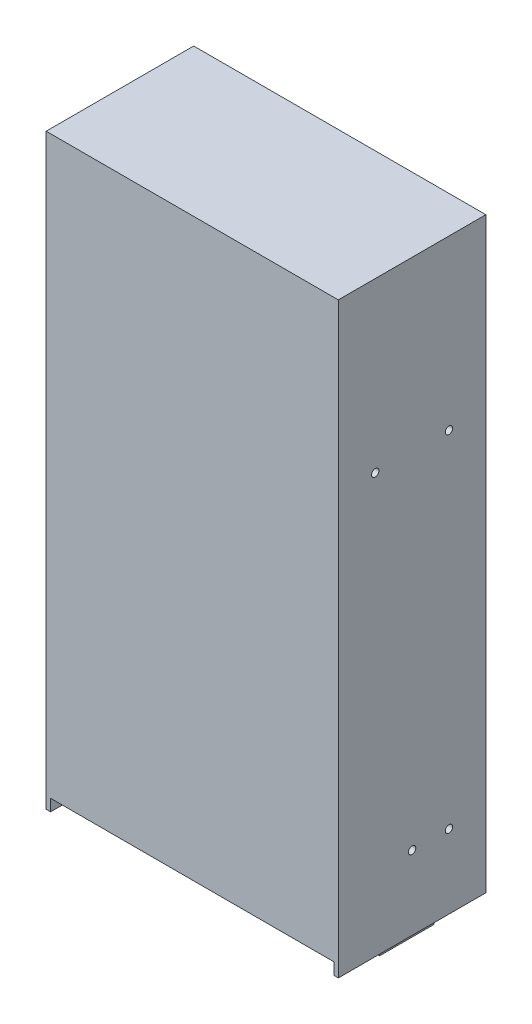
ISO-10303-21;
HEADER;
FILE_DESCRIPTION(('STEP AP214'),'2;1');
FILE_NAME('part.step','',(''),(''),'','','');
FILE_SCHEMA(('AUTOMOTIVE_DESIGN { 1 0 10303 214 1 1 1 1 }'));
ENDSEC;
DATA;
#1=APPLICATION_CONTEXT('core data for automotive mechanical design processes');
#2=APPLICATION_PROTOCOL_DEFINITION('international standard','automotive_design',2000,#1);
#3=PRODUCT_CONTEXT('',#1,'mechanical');
#4=PRODUCT('Part','Part','',(#3));
#5=PRODUCT_RELATED_PRODUCT_CATEGORY('part','',(#4));
#6=PRODUCT_DEFINITION_FORMATION('','',#4);
#7=PRODUCT_DEFINITION_CONTEXT('part definition',#1,'design');
#8=PRODUCT_DEFINITION('design','',#6,#7);
#9=PRODUCT_DEFINITION_SHAPE('','',#8);
#10=(LENGTH_UNIT() NAMED_UNIT(*) SI_UNIT(.MILLI.,.METRE.));
#11=(NAMED_UNIT(*) PLANE_ANGLE_UNIT() SI_UNIT($,.RADIAN.));
#12=(NAMED_UNIT(*) SI_UNIT($,.STERADIAN.) SOLID_ANGLE_UNIT());
#13=UNCERTAINTY_MEASURE_WITH_UNIT(LENGTH_MEASURE(1.E-05),#10,'distance_accuracy_value','');
#14=(GEOMETRIC_REPRESENTATION_CONTEXT(3) GLOBAL_UNCERTAINTY_ASSIGNED_CONTEXT((#13)) GLOBAL_UNIT_ASSIGNED_CONTEXT((#10,
#11,#12)) REPRESENTATION_CONTEXT('',''));
#15=CARTESIAN_POINT('',(0.,0.,0.));
#16=DIRECTION('',(0.,0.,1.));
#17=DIRECTION('',(1.,0.,0.));
#18=AXIS2_PLACEMENT_3D('',#15,#16,#17);
#19=CARTESIAN_POINT('',(-49.5,-99.5,50.));
#20=DIRECTION('',(0.,1.,0.));
#21=DIRECTION('',(0.,0.,1.));
#22=AXIS2_PLACEMENT_3D('',#19,#20,#21);
#23=PLANE('',#22);
#24=DIRECTION('',(1.,0.,0.));
#25=VECTOR('',#24,1.);
#26=CARTESIAN_POINT('',(39.,-99.5,7.));
#27=LINE('',#26,#25);
#28=CARTESIAN_POINT('',(-19.,-99.5,6.99999999999999));
#29=VERTEX_POINT('',#28);
#30=CARTESIAN_POINT('',(39.,-99.5,6.99999999999999));
#31=VERTEX_POINT('',#30);
#32=EDGE_CURVE('E165',#29,#31,#27,.T.);
#33=ORIENTED_EDGE('',*,*,#32,.F.);
#34=DIRECTION('',(0.,0.,-1.));
#35=VECTOR('',#34,1.);
#36=CARTESIAN_POINT('',(-19.,-99.5,25.5));
#37=LINE('',#36,#35);
#38=CARTESIAN_POINT('',(-19.,-99.5,10.5));
#39=VERTEX_POINT('',#38);
#40=EDGE_CURVE('E12',#39,#29,#37,.T.);
#41=ORIENTED_EDGE('',*,*,#40,.F.);
#42=DIRECTION('',(-1.,0.,0.));
#43=VECTOR('',#42,1.);
#44=CARTESIAN_POINT('',(-48.,-99.5,10.5));
#45=LINE('',#44,#43);
#46=CARTESIAN_POINT('',(-48.,-99.5,10.5));
#47=VERTEX_POINT('',#46);
#48=EDGE_CURVE('E62',#39,#47,#45,.T.);
#49=ORIENTED_EDGE('',*,*,#48,.T.);
#50=DIRECTION('',(0.,0.,1.));
#51=VECTOR('',#50,1.);
#52=CARTESIAN_POINT('',(-48.,-99.5,-96.0832971957145));
#53=LINE('',#52,#51);
#54=CARTESIAN_POINT('',(-48.,-99.5,50.));
#55=VERTEX_POINT('',#54);
#56=EDGE_CURVE('E226',#47,#55,#53,.T.);
#57=ORIENTED_EDGE('',*,*,#56,.T.);
#58=DIRECTION('',(1.,0.,0.));
#59=VECTOR('',#58,1.);
#60=CARTESIAN_POINT('',(-49.5,-99.5,50.));
#61=LINE('',#60,#59);
#62=CARTESIAN_POINT('',(-49.5,-99.5,50.));
#63=VERTEX_POINT('',#62);
#64=EDGE_CURVE('E241',#63,#55,#61,.T.);
#65=ORIENTED_EDGE('',*,*,#64,.F.);
#66=DIRECTION('',(0.,0.,-1.));
#67=VECTOR('',#66,1.);
#68=CARTESIAN_POINT('',(-49.5,-99.5,50.));
#69=LINE('',#68,#67);
#70=CARTESIAN_POINT('',(-49.5,-99.5,0.));
#71=VERTEX_POINT('',#70);
#72=EDGE_CURVE('E254',#63,#71,#69,.T.);
#73=ORIENTED_EDGE('',*,*,#72,.T.);
#74=DIRECTION('',(1.,0.,0.));
#75=VECTOR('',#74,1.);
#76=CARTESIAN_POINT('',(-49.5,-99.5,0.));
#77=LINE('',#76,#75);
#78=CARTESIAN_POINT('',(49.5,-99.5,0.));
#79=VERTEX_POINT('',#78);
#80=EDGE_CURVE('E236',#71,#79,#77,.T.);
#81=ORIENTED_EDGE('',*,*,#80,.T.);
#82=DIRECTION('',(0.,0.,-1.));
#83=VECTOR('',#82,1.);
#84=CARTESIAN_POINT('',(49.5,-99.5,50.));
#85=LINE('',#84,#83);
#86=CARTESIAN_POINT('',(49.5,-99.5,50.));
#87=VERTEX_POINT('',#86);
#88=EDGE_CURVE('E244',#87,#79,#85,.T.);
#89=ORIENTED_EDGE('',*,*,#88,.F.);
#90=CARTESIAN_POINT('',(48.,-99.5,50.));
#91=VERTEX_POINT('',#90);
#92=EDGE_CURVE('E240',#91,#87,#61,.T.);
#93=ORIENTED_EDGE('',*,*,#92,.F.);
#94=DIRECTION('',(0.,0.,1.));
#95=VECTOR('',#94,1.);
#96=CARTESIAN_POINT('',(48.,-99.5,-96.0832971957145));
#97=LINE('',#96,#95);
#98=CARTESIAN_POINT('',(48.,-99.5,1.5));
#99=VERTEX_POINT('',#98);
#100=EDGE_CURVE('E223',#99,#91,#97,.T.);
#101=ORIENTED_EDGE('',*,*,#100,.F.);
#102=DIRECTION('',(1.,0.,0.));
#103=VECTOR('',#102,1.);
#104=CARTESIAN_POINT('',(48.,-99.5,1.5));
#105=LINE('',#104,#103);
#106=CARTESIAN_POINT('',(39.,-99.5,1.5));
#107=VERTEX_POINT('',#106);
#108=EDGE_CURVE('E224',#107,#99,#105,.T.);
#109=ORIENTED_EDGE('',*,*,#108,.F.);
#110=DIRECTION('',(0.,0.,1.));
#111=VECTOR('',#110,1.);
#112=CARTESIAN_POINT('',(39.,-99.5,1.5));
#113=LINE('',#112,#111);
#114=EDGE_CURVE('E55',#107,#31,#113,.T.);
#115=ORIENTED_EDGE('',*,*,#114,.T.);
#116=EDGE_LOOP('',(#33,#41,#49,#57,#65,#73,#81,#89,#93,#101,#109,#115));
#117=FACE_BOUND('',#116,.T.);
#118=ADVANCED_FACE('F38',(#117),#23,.F.);
#119=CARTESIAN_POINT('',(49.5,-99.5,50.));
#120=DIRECTION('',(-1.,0.,0.));
#121=DIRECTION('',(0.,0.,1.));
#122=AXIS2_PLACEMENT_3D('',#119,#120,#121);
#123=PLANE('',#122);
#124=CARTESIAN_POINT('',(49.5,-74.5,12.5));
#125=DIRECTION('',(1.,0.,0.));
#126=DIRECTION('',(0.,0.,-1.));
#127=AXIS2_PLACEMENT_3D('',#124,#125,#126);
#128=CIRCLE('',#127,1.25);
#129=CARTESIAN_POINT('',(49.5,-74.5,11.25));
#130=VERTEX_POINT('',#129);
#131=EDGE_CURVE('E634',#130,#130,#128,.T.);
#132=ORIENTED_EDGE('',*,*,#131,.F.);
#133=EDGE_LOOP('',(#132));
#134=FACE_BOUND('',#133,.T.);
#135=CARTESIAN_POINT('',(49.5,-74.5,25.));
#136=DIRECTION('',(1.,0.,0.));
#137=DIRECTION('',(0.,0.,-1.));
#138=AXIS2_PLACEMENT_3D('',#135,#136,#137);
#139=CIRCLE('',#138,1.25);
#140=CARTESIAN_POINT('',(49.5,-74.5,23.75));
#141=VERTEX_POINT('',#140);
#142=EDGE_CURVE('E639',#141,#141,#139,.T.);
#143=ORIENTED_EDGE('',*,*,#142,.F.);
#144=EDGE_LOOP('',(#143));
#145=FACE_BOUND('',#144,.T.);
#146=CARTESIAN_POINT('',(49.5,42.5,12.5));
#147=DIRECTION('',(1.,0.,0.));
#148=DIRECTION('',(0.,0.,-1.));
#149=AXIS2_PLACEMENT_3D('',#146,#147,#148);
#150=CIRCLE('',#149,1.25);
#151=CARTESIAN_POINT('',(49.5,42.5,11.25));
#152=VERTEX_POINT('',#151);
#153=EDGE_CURVE('E645',#152,#152,#150,.T.);
#154=ORIENTED_EDGE('',*,*,#153,.F.);
#155=EDGE_LOOP('',(#154));
#156=FACE_BOUND('',#155,.T.);
#157=CARTESIAN_POINT('',(49.5,42.5,37.5));
#158=DIRECTION('',(1.,0.,0.));
#159=DIRECTION('',(0.,0.,-1.));
#160=AXIS2_PLACEMENT_3D('',#157,#158,#159);
#161=CIRCLE('',#160,1.25);
#162=CARTESIAN_POINT('',(49.5,42.5,36.25));
#163=VERTEX_POINT('',#162);
#164=EDGE_CURVE('E651',#163,#163,#161,.T.);
#165=ORIENTED_EDGE('',*,*,#164,.F.);
#166=EDGE_LOOP('',(#165));
#167=FACE_BOUND('',#166,.T.);
#168=DIRECTION('',(0.,1.,0.));
#169=VECTOR('',#168,1.);
#170=CARTESIAN_POINT('',(49.5,-99.5,0.));
#171=LINE('',#170,#169);
#172=CARTESIAN_POINT('',(49.5,99.5,0.));
#173=VERTEX_POINT('',#172);
#174=EDGE_CURVE('E231',#79,#173,#171,.T.);
#175=ORIENTED_EDGE('',*,*,#174,.T.);
#176=DIRECTION('',(0.,0.,-1.));
#177=VECTOR('',#176,1.);
#178=CARTESIAN_POINT('',(49.5,99.5,50.));
#179=LINE('',#178,#177);
#180=CARTESIAN_POINT('',(49.5,99.5,50.));
#181=VERTEX_POINT('',#180);
#182=EDGE_CURVE('E47',#181,#173,#179,.T.);
#183=ORIENTED_EDGE('',*,*,#182,.F.);
#184=DIRECTION('',(0.,1.,0.));
#185=VECTOR('',#184,1.);
#186=CARTESIAN_POINT('',(49.5,-99.5,50.));
#187=LINE('',#186,#185);
#188=EDGE_CURVE('E232',#87,#181,#187,.T.);
#189=ORIENTED_EDGE('',*,*,#188,.F.);
#190=ORIENTED_EDGE('',*,*,#88,.T.);
#191=EDGE_LOOP('',(#175,#183,#189,#190));
#192=FACE_BOUND('',#191,.T.);
#193=ADVANCED_FACE('F40',(#134,#145,#156,#167,#192),#123,.F.);
#194=CARTESIAN_POINT('',(-49.5,99.5,50.));
#195=DIRECTION('',(0.,-1.,0.));
#196=DIRECTION('',(0.,0.,-1.));
#197=AXIS2_PLACEMENT_3D('',#194,#195,#196);
#198=PLANE('',#197);
#199=DIRECTION('',(-1.,0.,0.));
#200=VECTOR('',#199,1.);
#201=CARTESIAN_POINT('',(-49.5,99.5,0.));
#202=LINE('',#201,#200);
#203=CARTESIAN_POINT('',(-49.5,99.5,0.));
#204=VERTEX_POINT('',#203);
#205=EDGE_CURVE('E247',#173,#204,#202,.T.);
#206=ORIENTED_EDGE('',*,*,#205,.T.);
#207=DIRECTION('',(0.,0.,-1.));
#208=VECTOR('',#207,1.);
#209=CARTESIAN_POINT('',(-49.5,99.5,50.));
#210=LINE('',#209,#208);
#211=CARTESIAN_POINT('',(-49.5,99.5,50.));
#212=VERTEX_POINT('',#211);
#213=EDGE_CURVE('E256',#212,#204,#210,.T.);
#214=ORIENTED_EDGE('',*,*,#213,.F.);
#215=DIRECTION('',(-1.,0.,0.));
#216=VECTOR('',#215,1.);
#217=CARTESIAN_POINT('',(-49.5,99.5,50.));
#218=LINE('',#217,#216);
#219=EDGE_CURVE('E235',#181,#212,#218,.T.);
#220=ORIENTED_EDGE('',*,*,#219,.F.);
#221=ORIENTED_EDGE('',*,*,#182,.T.);
#222=EDGE_LOOP('',(#206,#214,#220,#221));
#223=FACE_BOUND('',#222,.T.);
#224=ADVANCED_FACE('F265',(#223),#198,.F.);
#225=CARTESIAN_POINT('',(-49.5,-99.5,50.));
#226=DIRECTION('',(1.,0.,0.));
#227=DIRECTION('',(0.,0.,-1.));
#228=AXIS2_PLACEMENT_3D('',#225,#226,#227);
#229=PLANE('',#228);
#230=CARTESIAN_POINT('',(-49.5,42.5,12.5));
#231=DIRECTION('',(-1.,0.,0.));
#232=DIRECTION('',(0.,0.,1.));
#233=AXIS2_PLACEMENT_3D('',#230,#231,#232);
#234=CIRCLE('',#233,1.25);
#235=CARTESIAN_POINT('',(-49.5,42.5,13.75));
#236=VERTEX_POINT('',#235);
#237=EDGE_CURVE('E625',#236,#236,#234,.T.);
#238=ORIENTED_EDGE('',*,*,#237,.F.);
#239=EDGE_LOOP('',(#238));
#240=FACE_BOUND('',#239,.T.);
#241=CARTESIAN_POINT('',(-49.5,-74.5,12.5));
#242=DIRECTION('',(-1.,0.,0.));
#243=DIRECTION('',(0.,0.,1.));
#244=AXIS2_PLACEMENT_3D('',#241,#242,#243);
#245=CIRCLE('',#244,1.25);
#246=CARTESIAN_POINT('',(-49.5,-74.5,13.75));
#247=VERTEX_POINT('',#246);
#248=EDGE_CURVE('E624',#247,#247,#245,.T.);
#249=ORIENTED_EDGE('',*,*,#248,.F.);
#250=EDGE_LOOP('',(#249));
#251=FACE_BOUND('',#250,.T.);
#252=DIRECTION('',(0.,-1.,0.));
#253=VECTOR('',#252,1.);
#254=CARTESIAN_POINT('',(-49.5,-99.5,0.));
#255=LINE('',#254,#253);
#256=EDGE_CURVE('E249',#204,#71,#255,.T.);
#257=ORIENTED_EDGE('',*,*,#256,.T.);
#258=ORIENTED_EDGE('',*,*,#72,.F.);
#259=DIRECTION('',(0.,-1.,0.));
#260=VECTOR('',#259,1.);
#261=CARTESIAN_POINT('',(-49.5,-99.5,50.));
#262=LINE('',#261,#260);
#263=EDGE_CURVE('E238',#212,#63,#262,.T.);
#264=ORIENTED_EDGE('',*,*,#263,.F.);
#265=ORIENTED_EDGE('',*,*,#213,.T.);
#266=EDGE_LOOP('',(#257,#258,#264,#265));
#267=FACE_BOUND('',#266,.T.);
#268=ADVANCED_FACE('F274',(#240,#251,#267),#229,.F.);
#269=CARTESIAN_POINT('',(0.,0.,50.));
#270=DIRECTION('',(0.,0.,-1.));
#271=DIRECTION('',(-1.,0.,0.));
#272=AXIS2_PLACEMENT_3D('',#269,#270,#271);
#273=PLANE('',#272);
#274=ORIENTED_EDGE('',*,*,#64,.T.);
#275=DIRECTION('',(0.,-1.,0.));
#276=VECTOR('',#275,1.);
#277=CARTESIAN_POINT('',(-48.,-99.5,50.));
#278=LINE('',#277,#276);
#279=CARTESIAN_POINT('',(-48.,-95.5,50.));
#280=VERTEX_POINT('',#279);
#281=EDGE_CURVE('E207',#280,#55,#278,.T.);
#282=ORIENTED_EDGE('',*,*,#281,.F.);
#283=DIRECTION('',(-1.,0.,0.));
#284=VECTOR('',#283,1.);
#285=CARTESIAN_POINT('',(48.,-95.5,50.));
#286=LINE('',#285,#284);
#287=CARTESIAN_POINT('',(48.,-95.5,50.));
#288=VERTEX_POINT('',#287);
#289=EDGE_CURVE('E211',#288,#280,#286,.T.);
#290=ORIENTED_EDGE('',*,*,#289,.F.);
#291=DIRECTION('',(0.,1.,0.));
#292=VECTOR('',#291,1.);
#293=CARTESIAN_POINT('',(48.,-99.5,50.));
#294=LINE('',#293,#292);
#295=EDGE_CURVE('E206',#91,#288,#294,.T.);
#296=ORIENTED_EDGE('',*,*,#295,.F.);
#297=ORIENTED_EDGE('',*,*,#92,.T.);
#298=ORIENTED_EDGE('',*,*,#188,.T.);
#299=ORIENTED_EDGE('',*,*,#219,.T.);
#300=ORIENTED_EDGE('',*,*,#263,.T.);
#301=EDGE_LOOP('',(#274,#282,#290,#296,#297,#298,#299,#300));
#302=FACE_BOUND('',#301,.T.);
#303=ADVANCED_FACE('F279',(#302),#273,.F.);
#304=CARTESIAN_POINT('',(0.,0.,0.));
#305=DIRECTION('',(0.,0.,-1.));
#306=DIRECTION('',(-1.,0.,0.));
#307=AXIS2_PLACEMENT_3D('',#304,#305,#306);
#308=PLANE('',#307);
#309=CARTESIAN_POINT('',(39.5,88.5,0.));
#310=DIRECTION('',(0.,0.,1.));
#311=DIRECTION('',(1.,0.,0.));
#312=AXIS2_PLACEMENT_3D('',#309,#310,#311);
#313=CIRCLE('',#312,1.25);
#314=CARTESIAN_POINT('',(40.75,88.5,0.));
#315=VERTEX_POINT('',#314);
#316=EDGE_CURVE('E660',#315,#315,#313,.T.);
#317=ORIENTED_EDGE('',*,*,#316,.T.);
#318=EDGE_LOOP('',(#317));
#319=FACE_BOUND('',#318,.T.);
#320=CARTESIAN_POINT('',(-39.5,88.5,0.));
#321=DIRECTION('',(0.,0.,1.));
#322=DIRECTION('',(1.,0.,0.));
#323=AXIS2_PLACEMENT_3D('',#320,#321,#322);
#324=CIRCLE('',#323,1.25);
#325=CARTESIAN_POINT('',(-38.25,88.5,0.));
#326=VERTEX_POINT('',#325);
#327=EDGE_CURVE('E666',#326,#326,#324,.T.);
#328=ORIENTED_EDGE('',*,*,#327,.T.);
#329=EDGE_LOOP('',(#328));
#330=FACE_BOUND('',#329,.T.);
#331=CARTESIAN_POINT('',(-39.5,-79.5,0.));
#332=DIRECTION('',(0.,0.,1.));
#333=DIRECTION('',(1.,0.,0.));
#334=AXIS2_PLACEMENT_3D('',#331,#332,#333);
#335=CIRCLE('',#334,1.25);
#336=CARTESIAN_POINT('',(-38.25,-79.5,0.));
#337=VERTEX_POINT('',#336);
#338=EDGE_CURVE('E672',#337,#337,#335,.T.);
#339=ORIENTED_EDGE('',*,*,#338,.T.);
#340=EDGE_LOOP('',(#339));
#341=FACE_BOUND('',#340,.T.);
#342=CARTESIAN_POINT('',(11.5,-79.5,0.));
#343=DIRECTION('',(0.,0.,1.));
#344=DIRECTION('',(1.,0.,0.));
#345=AXIS2_PLACEMENT_3D('',#342,#343,#344);
#346=CIRCLE('',#345,1.25);
#347=CARTESIAN_POINT('',(12.75,-79.5,0.));
#348=VERTEX_POINT('',#347);
#349=EDGE_CURVE('E167',#348,#348,#346,.T.);
#350=ORIENTED_EDGE('',*,*,#349,.T.);
#351=EDGE_LOOP('',(#350));
#352=FACE_BOUND('',#351,.T.);
#353=ORIENTED_EDGE('',*,*,#174,.F.);
#354=ORIENTED_EDGE('',*,*,#80,.F.);
#355=ORIENTED_EDGE('',*,*,#256,.F.);
#356=ORIENTED_EDGE('',*,*,#205,.F.);
#357=EDGE_LOOP('',(#353,#354,#355,#356));
#358=FACE_BOUND('',#357,.T.);
#359=ADVANCED_FACE('F272',(#319,#330,#341,#352,#358),#308,.T.);
#360=CARTESIAN_POINT('',(0.,0.,1.5));
#361=DIRECTION('',(0.,0.,-1.));
#362=DIRECTION('',(-1.,0.,0.));
#363=AXIS2_PLACEMENT_3D('',#360,#361,#362);
#364=PLANE('',#363);
#365=DIRECTION('',(-1.,0.,0.));
#366=VECTOR('',#365,1.);
#367=CARTESIAN_POINT('',(48.,-95.5,1.5));
#368=LINE('',#367,#366);
#369=CARTESIAN_POINT('',(48.,-95.5,1.5));
#370=VERTEX_POINT('',#369);
#371=CARTESIAN_POINT('',(39.,-95.5000000000155,1.5));
#372=VERTEX_POINT('',#371);
#373=EDGE_CURVE('E210',#370,#372,#368,.T.);
#374=ORIENTED_EDGE('',*,*,#373,.T.);
#375=DIRECTION('',(0.,-1.,0.));
#376=VECTOR('',#375,1.);
#377=CARTESIAN_POINT('',(39.,500000.,1.5));
#378=LINE('',#377,#376);
#379=EDGE_CURVE('E187',#372,#107,#378,.T.);
#380=ORIENTED_EDGE('',*,*,#379,.T.);
#381=ORIENTED_EDGE('',*,*,#108,.T.);
#382=DIRECTION('',(0.,1.,0.));
#383=VECTOR('',#382,1.);
#384=CARTESIAN_POINT('',(48.,-99.5,1.5));
#385=LINE('',#384,#383);
#386=EDGE_CURVE('E219',#99,#370,#385,.T.);
#387=ORIENTED_EDGE('',*,*,#386,.T.);
#388=EDGE_LOOP('',(#374,#380,#381,#387));
#389=FACE_BOUND('',#388,.T.);
#390=ADVANCED_FACE('F289',(#389),#364,.F.);
#391=CARTESIAN_POINT('',(48.,-95.5,-96.0832971957145));
#392=DIRECTION('',(0.,1.,0.));
#393=DIRECTION('',(0.,0.,1.));
#394=AXIS2_PLACEMENT_3D('',#391,#392,#393);
#395=PLANE('',#394);
#396=DIRECTION('',(0.,0.,1.));
#397=VECTOR('',#396,1.);
#398=CARTESIAN_POINT('',(-48.,-95.5,-96.0832971957145));
#399=LINE('',#398,#397);
#400=CARTESIAN_POINT('',(-48.,-95.5000000000155,10.5));
#401=VERTEX_POINT('',#400);
#402=EDGE_CURVE('E218',#401,#280,#399,.T.);
#403=ORIENTED_EDGE('',*,*,#402,.F.);
#404=DIRECTION('',(-1.,0.,0.));
#405=VECTOR('',#404,1.);
#406=CARTESIAN_POINT('',(-48.,-95.5000000000155,10.5));
#407=LINE('',#406,#405);
#408=CARTESIAN_POINT('',(-19.,-95.5000000000155,10.5));
#409=VERTEX_POINT('',#408);
#410=EDGE_CURVE('E150',#409,#401,#407,.T.);
#411=ORIENTED_EDGE('',*,*,#410,.F.);
#412=DIRECTION('',(0.,0.,-1.));
#413=VECTOR('',#412,1.);
#414=CARTESIAN_POINT('',(-19.,-95.5000000000155,10.5));
#415=LINE('',#414,#413);
#416=CARTESIAN_POINT('',(-19.,-95.5000000000155,25.5));
#417=VERTEX_POINT('',#416);
#418=EDGE_CURVE('E201',#417,#409,#415,.T.);
#419=ORIENTED_EDGE('',*,*,#418,.F.);
#420=DIRECTION('',(-1.,0.,0.));
#421=VECTOR('',#420,1.);
#422=CARTESIAN_POINT('',(39.,-95.5000000000155,25.5));
#423=LINE('',#422,#421);
#424=CARTESIAN_POINT('',(39.,-95.5000000000155,25.5));
#425=VERTEX_POINT('',#424);
#426=EDGE_CURVE('E203',#425,#417,#423,.T.);
#427=ORIENTED_EDGE('',*,*,#426,.F.);
#428=DIRECTION('',(0.,0.,1.));
#429=VECTOR('',#428,1.);
#430=CARTESIAN_POINT('',(39.,-95.5000000000155,1.5));
#431=LINE('',#430,#429);
#432=EDGE_CURVE('E147',#372,#425,#431,.T.);
#433=ORIENTED_EDGE('',*,*,#432,.F.);
#434=ORIENTED_EDGE('',*,*,#373,.F.);
#435=DIRECTION('',(0.,0.,1.));
#436=VECTOR('',#435,1.);
#437=CARTESIAN_POINT('',(48.,-95.5,-96.0832971957145));
#438=LINE('',#437,#436);
#439=EDGE_CURVE('E222',#370,#288,#438,.T.);
#440=ORIENTED_EDGE('',*,*,#439,.T.);
#441=ORIENTED_EDGE('',*,*,#289,.T.);
#442=EDGE_LOOP('',(#403,#411,#419,#427,#433,#434,#440,#441));
#443=FACE_BOUND('',#442,.T.);
#444=ADVANCED_FACE('F292',(#443),#395,.F.);
#445=CARTESIAN_POINT('',(-48.,-99.5,-96.0832971957145));
#446=DIRECTION('',(-1.,0.,0.));
#447=DIRECTION('',(0.,0.,1.));
#448=AXIS2_PLACEMENT_3D('',#445,#446,#447);
#449=PLANE('',#448);
#450=ORIENTED_EDGE('',*,*,#56,.F.);
#451=DIRECTION('',(0.,-1.,0.));
#452=VECTOR('',#451,1.);
#453=CARTESIAN_POINT('',(-48.,500000.,10.5));
#454=LINE('',#453,#452);
#455=EDGE_CURVE('E196',#401,#47,#454,.T.);
#456=ORIENTED_EDGE('',*,*,#455,.F.);
#457=ORIENTED_EDGE('',*,*,#402,.T.);
#458=ORIENTED_EDGE('',*,*,#281,.T.);
#459=EDGE_LOOP('',(#450,#456,#457,#458));
#460=FACE_BOUND('',#459,.T.);
#461=ADVANCED_FACE('F305',(#460),#449,.F.);
#462=CARTESIAN_POINT('',(48.,-99.5,-96.0832971957145));
#463=DIRECTION('',(1.,0.,0.));
#464=DIRECTION('',(0.,0.,-1.));
#465=AXIS2_PLACEMENT_3D('',#462,#463,#464);
#466=PLANE('',#465);
#467=ORIENTED_EDGE('',*,*,#100,.T.);
#468=ORIENTED_EDGE('',*,*,#295,.T.);
#469=ORIENTED_EDGE('',*,*,#439,.F.);
#470=ORIENTED_EDGE('',*,*,#386,.F.);
#471=EDGE_LOOP('',(#467,#468,#469,#470));
#472=FACE_BOUND('',#471,.T.);
#473=ADVANCED_FACE('F286',(#472),#466,.F.);
#474=CARTESIAN_POINT('',(-48.,500000.,10.5));
#475=DIRECTION('',(0.,0.,1.));
#476=DIRECTION('',(1.,0.,0.));
#477=AXIS2_PLACEMENT_3D('',#474,#475,#476);
#478=PLANE('',#477);
#479=DIRECTION('',(0.,-1.,0.));
#480=VECTOR('',#479,1.);
#481=CARTESIAN_POINT('',(-19.,500000.,10.5));
#482=LINE('',#481,#480);
#483=EDGE_CURVE('E195',#409,#39,#482,.T.);
#484=ORIENTED_EDGE('',*,*,#483,.F.);
#485=ORIENTED_EDGE('',*,*,#410,.T.);
#486=ORIENTED_EDGE('',*,*,#455,.T.);
#487=ORIENTED_EDGE('',*,*,#48,.F.);
#488=EDGE_LOOP('',(#484,#485,#486,#487));
#489=FACE_BOUND('',#488,.T.);
#490=ADVANCED_FACE('F302',(#489),#478,.T.);
#491=CARTESIAN_POINT('',(-19.,500000.,10.5));
#492=DIRECTION('',(-1.,0.,0.));
#493=DIRECTION('',(0.,0.,1.));
#494=AXIS2_PLACEMENT_3D('',#491,#492,#493);
#495=PLANE('',#494);
#496=DIRECTION('',(0.,-1.,0.));
#497=VECTOR('',#496,1.);
#498=CARTESIAN_POINT('',(-19.,500000.,25.5));
#499=LINE('',#498,#497);
#500=CARTESIAN_POINT('',(-19.,-110.5,25.5));
#501=VERTEX_POINT('',#500);
#502=EDGE_CURVE('E151',#417,#501,#499,.T.);
#503=ORIENTED_EDGE('',*,*,#502,.F.);
#504=ORIENTED_EDGE('',*,*,#418,.T.);
#505=ORIENTED_EDGE('',*,*,#483,.T.);
#506=ORIENTED_EDGE('',*,*,#40,.T.);
#507=DIRECTION('',(0.,1.,0.));
#508=VECTOR('',#507,1.);
#509=CARTESIAN_POINT('',(-19.,-110.5,6.99999999999999));
#510=LINE('',#509,#508);
#511=CARTESIAN_POINT('',(-19.,-110.5,6.99999999999999));
#512=VERTEX_POINT('',#511);
#513=EDGE_CURVE('E178',#512,#29,#510,.T.);
#514=ORIENTED_EDGE('',*,*,#513,.F.);
#515=DIRECTION('',(0.,0.,-1.));
#516=VECTOR('',#515,1.);
#517=CARTESIAN_POINT('',(-19.,-110.5,25.5));
#518=LINE('',#517,#516);
#519=EDGE_CURVE('E159',#501,#512,#518,.T.);
#520=ORIENTED_EDGE('',*,*,#519,.F.);
#521=EDGE_LOOP('',(#503,#504,#505,#506,#514,#520));
#522=FACE_BOUND('',#521,.T.);
#523=ADVANCED_FACE('F296',(#522),#495,.T.);
#524=CARTESIAN_POINT('',(39.,500000.,25.5));
#525=DIRECTION('',(0.,0.,1.));
#526=DIRECTION('',(1.,0.,0.));
#527=AXIS2_PLACEMENT_3D('',#524,#525,#526);
#528=PLANE('',#527);
#529=DIRECTION('',(0.,-1.,0.));
#530=VECTOR('',#529,1.);
#531=CARTESIAN_POINT('',(39.,500000.,25.5));
#532=LINE('',#531,#530);
#533=CARTESIAN_POINT('',(39.,-110.5,25.5));
#534=VERTEX_POINT('',#533);
#535=EDGE_CURVE('E140',#425,#534,#532,.T.);
#536=ORIENTED_EDGE('',*,*,#535,.F.);
#537=ORIENTED_EDGE('',*,*,#426,.T.);
#538=ORIENTED_EDGE('',*,*,#502,.T.);
#539=DIRECTION('',(-1.,0.,0.));
#540=VECTOR('',#539,1.);
#541=CARTESIAN_POINT('',(39.,-110.5,25.5));
#542=LINE('',#541,#540);
#543=EDGE_CURVE('E154',#534,#501,#542,.T.);
#544=ORIENTED_EDGE('',*,*,#543,.F.);
#545=EDGE_LOOP('',(#536,#537,#538,#544));
#546=FACE_BOUND('',#545,.T.);
#547=ADVANCED_FACE('F155',(#546),#528,.T.);
#548=CARTESIAN_POINT('',(39.,500000.,1.5));
#549=DIRECTION('',(1.,0.,0.));
#550=DIRECTION('',(0.,0.,-1.));
#551=AXIS2_PLACEMENT_3D('',#548,#549,#550);
#552=PLANE('',#551);
#553=ORIENTED_EDGE('',*,*,#379,.F.);
#554=ORIENTED_EDGE('',*,*,#432,.T.);
#555=ORIENTED_EDGE('',*,*,#535,.T.);
#556=DIRECTION('',(0.,0.,1.));
#557=VECTOR('',#556,1.);
#558=CARTESIAN_POINT('',(39.,-110.5,25.5));
#559=LINE('',#558,#557);
#560=CARTESIAN_POINT('',(39.,-110.5,7.));
#561=VERTEX_POINT('',#560);
#562=EDGE_CURVE('E145',#561,#534,#559,.T.);
#563=ORIENTED_EDGE('',*,*,#562,.F.);
#564=DIRECTION('',(0.,1.,0.));
#565=VECTOR('',#564,1.);
#566=CARTESIAN_POINT('',(39.,-110.5,7.));
#567=LINE('',#566,#565);
#568=EDGE_CURVE('E175',#561,#31,#567,.T.);
#569=ORIENTED_EDGE('',*,*,#568,.T.);
#570=ORIENTED_EDGE('',*,*,#114,.F.);
#571=EDGE_LOOP('',(#553,#554,#555,#563,#569,#570));
#572=FACE_BOUND('',#571,.T.);
#573=ADVANCED_FACE('F142',(#572),#552,.T.);
#574=CARTESIAN_POINT('',(39.,-110.5,7.));
#575=DIRECTION('',(0.,0.,1.));
#576=DIRECTION('',(1.,0.,0.));
#577=AXIS2_PLACEMENT_3D('',#574,#575,#576);
#578=PLANE('',#577);
#579=ORIENTED_EDGE('',*,*,#32,.T.);
#580=ORIENTED_EDGE('',*,*,#568,.F.);
#581=DIRECTION('',(1.,0.,0.));
#582=VECTOR('',#581,1.);
#583=CARTESIAN_POINT('',(39.,-110.5,7.));
#584=LINE('',#583,#582);
#585=EDGE_CURVE('E163',#512,#561,#584,.T.);
#586=ORIENTED_EDGE('',*,*,#585,.F.);
#587=ORIENTED_EDGE('',*,*,#513,.T.);
#588=EDGE_LOOP('',(#579,#580,#586,#587));
#589=FACE_BOUND('',#588,.T.);
#590=ADVANCED_FACE('F299',(#589),#578,.F.);
#591=CARTESIAN_POINT('',(0.,-110.5,0.));
#592=DIRECTION('',(0.,1.,0.));
#593=DIRECTION('',(0.,0.,1.));
#594=AXIS2_PLACEMENT_3D('',#591,#592,#593);
#595=PLANE('',#594);
#596=ORIENTED_EDGE('',*,*,#562,.T.);
#597=ORIENTED_EDGE('',*,*,#543,.T.);
#598=ORIENTED_EDGE('',*,*,#519,.T.);
#599=ORIENTED_EDGE('',*,*,#585,.T.);
#600=EDGE_LOOP('',(#596,#597,#598,#599));
#601=FACE_BOUND('',#600,.T.);
#602=ADVANCED_FACE('F161',(#601),#595,.F.);
#603=CARTESIAN_POINT('',(11.5,-79.5,0.));
#604=DIRECTION('',(0.,0.,1.));
#605=DIRECTION('',(1.,0.,0.));
#606=AXIS2_PLACEMENT_3D('',#603,#604,#605);
#607=CYLINDRICAL_SURFACE('',#606,1.25);
#608=ORIENTED_EDGE('',*,*,#349,.F.);
#609=EDGE_LOOP('',(#608));
#610=FACE_BOUND('',#609,.T.);
#611=CARTESIAN_POINT('',(11.5,-79.5,1.5));
#612=DIRECTION('',(0.,0.,1.));
#613=DIRECTION('',(1.,0.,0.));
#614=AXIS2_PLACEMENT_3D('',#611,#612,#613);
#615=CIRCLE('',#614,1.25);
#616=CARTESIAN_POINT('',(12.75,-79.5,1.5));
#617=VERTEX_POINT('',#616);
#618=EDGE_CURVE('E170',#617,#617,#615,.T.);
#619=ORIENTED_EDGE('',*,*,#618,.T.);
#620=EDGE_LOOP('',(#619));
#621=FACE_BOUND('',#620,.T.);
#622=ADVANCED_FACE('F420',(#610,#621),#607,.F.);
#623=CARTESIAN_POINT('',(11.5,-79.5,1.5));
#624=DIRECTION('',(0.,0.,1.));
#625=DIRECTION('',(1.,0.,0.));
#626=AXIS2_PLACEMENT_3D('',#623,#624,#625);
#627=PLANE('',#626);
#628=ORIENTED_EDGE('',*,*,#618,.F.);
#629=EDGE_LOOP('',(#628));
#630=FACE_BOUND('',#629,.T.);
#631=ADVANCED_FACE('F429',(#630),#627,.F.);
#632=CARTESIAN_POINT('',(-39.5,-79.5,0.));
#633=DIRECTION('',(0.,0.,1.));
#634=DIRECTION('',(1.,0.,0.));
#635=AXIS2_PLACEMENT_3D('',#632,#633,#634);
#636=CYLINDRICAL_SURFACE('',#635,1.25);
#637=ORIENTED_EDGE('',*,*,#338,.F.);
#638=EDGE_LOOP('',(#637));
#639=FACE_BOUND('',#638,.T.);
#640=CARTESIAN_POINT('',(-39.5,-79.5,1.5));
#641=DIRECTION('',(0.,0.,1.));
#642=DIRECTION('',(1.,0.,0.));
#643=AXIS2_PLACEMENT_3D('',#640,#641,#642);
#644=CIRCLE('',#643,1.25);
#645=CARTESIAN_POINT('',(-38.25,-79.5,1.5));
#646=VERTEX_POINT('',#645);
#647=EDGE_CURVE('E669',#646,#646,#644,.T.);
#648=ORIENTED_EDGE('',*,*,#647,.T.);
#649=EDGE_LOOP('',(#648));
#650=FACE_BOUND('',#649,.T.);
#651=ADVANCED_FACE('F436',(#639,#650),#636,.F.);
#652=CARTESIAN_POINT('',(-39.5,-79.5,1.5));
#653=DIRECTION('',(0.,0.,1.));
#654=DIRECTION('',(1.,0.,0.));
#655=AXIS2_PLACEMENT_3D('',#652,#653,#654);
#656=PLANE('',#655);
#657=ORIENTED_EDGE('',*,*,#647,.F.);
#658=EDGE_LOOP('',(#657));
#659=FACE_BOUND('',#658,.T.);
#660=ADVANCED_FACE('F444',(#659),#656,.F.);
#661=CARTESIAN_POINT('',(-39.5,88.5,0.));
#662=DIRECTION('',(0.,0.,1.));
#663=DIRECTION('',(1.,0.,0.));
#664=AXIS2_PLACEMENT_3D('',#661,#662,#663);
#665=CYLINDRICAL_SURFACE('',#664,1.25);
#666=ORIENTED_EDGE('',*,*,#327,.F.);
#667=EDGE_LOOP('',(#666));
#668=FACE_BOUND('',#667,.T.);
#669=CARTESIAN_POINT('',(-39.5,88.5,1.5));
#670=DIRECTION('',(0.,0.,1.));
#671=DIRECTION('',(1.,0.,0.));
#672=AXIS2_PLACEMENT_3D('',#669,#670,#671);
#673=CIRCLE('',#672,1.25);
#674=CARTESIAN_POINT('',(-38.25,88.5,1.5));
#675=VERTEX_POINT('',#674);
#676=EDGE_CURVE('E663',#675,#675,#673,.T.);
#677=ORIENTED_EDGE('',*,*,#676,.T.);
#678=EDGE_LOOP('',(#677));
#679=FACE_BOUND('',#678,.T.);
#680=ADVANCED_FACE('F452',(#668,#679),#665,.F.);
#681=CARTESIAN_POINT('',(-39.5,88.5,1.5));
#682=DIRECTION('',(0.,0.,1.));
#683=DIRECTION('',(1.,0.,0.));
#684=AXIS2_PLACEMENT_3D('',#681,#682,#683);
#685=PLANE('',#684);
#686=ORIENTED_EDGE('',*,*,#676,.F.);
#687=EDGE_LOOP('',(#686));
#688=FACE_BOUND('',#687,.T.);
#689=ADVANCED_FACE('F460',(#688),#685,.F.);
#690=CARTESIAN_POINT('',(39.5,88.5,0.));
#691=DIRECTION('',(0.,0.,1.));
#692=DIRECTION('',(1.,0.,0.));
#693=AXIS2_PLACEMENT_3D('',#690,#691,#692);
#694=CYLINDRICAL_SURFACE('',#693,1.25);
#695=ORIENTED_EDGE('',*,*,#316,.F.);
#696=EDGE_LOOP('',(#695));
#697=FACE_BOUND('',#696,.T.);
#698=CARTESIAN_POINT('',(39.5,88.5,1.5));
#699=DIRECTION('',(0.,0.,1.));
#700=DIRECTION('',(1.,0.,0.));
#701=AXIS2_PLACEMENT_3D('',#698,#699,#700);
#702=CIRCLE('',#701,1.25);
#703=CARTESIAN_POINT('',(40.75,88.5,1.5));
#704=VERTEX_POINT('',#703);
#705=EDGE_CURVE('E657',#704,#704,#702,.T.);
#706=ORIENTED_EDGE('',*,*,#705,.T.);
#707=EDGE_LOOP('',(#706));
#708=FACE_BOUND('',#707,.T.);
#709=ADVANCED_FACE('F468',(#697,#708),#694,.F.);
#710=CARTESIAN_POINT('',(39.5,88.5,1.5));
#711=DIRECTION('',(0.,0.,1.));
#712=DIRECTION('',(1.,0.,0.));
#713=AXIS2_PLACEMENT_3D('',#710,#711,#712);
#714=PLANE('',#713);
#715=ORIENTED_EDGE('',*,*,#705,.F.);
#716=EDGE_LOOP('',(#715));
#717=FACE_BOUND('',#716,.T.);
#718=ADVANCED_FACE('F476',(#717),#714,.F.);
#719=CARTESIAN_POINT('',(44.5,42.5,37.5));
#720=DIRECTION('',(1.,0.,0.));
#721=DIRECTION('',(0.,0.,-1.));
#722=AXIS2_PLACEMENT_3D('',#719,#720,#721);
#723=CYLINDRICAL_SURFACE('',#722,1.25);
#724=CARTESIAN_POINT('',(44.5,42.5,37.5));
#725=DIRECTION('',(1.,0.,0.));
#726=DIRECTION('',(0.,0.,-1.));
#727=AXIS2_PLACEMENT_3D('',#724,#725,#726);
#728=CIRCLE('',#727,1.25);
#729=CARTESIAN_POINT('',(44.5,42.5,36.25));
#730=VERTEX_POINT('',#729);
#731=EDGE_CURVE('E654',#730,#730,#728,.T.);
#732=ORIENTED_EDGE('',*,*,#731,.F.);
#733=EDGE_LOOP('',(#732));
#734=FACE_BOUND('',#733,.T.);
#735=ORIENTED_EDGE('',*,*,#164,.T.);
#736=EDGE_LOOP('',(#735));
#737=FACE_BOUND('',#736,.T.);
#738=ADVANCED_FACE('F484',(#734,#737),#723,.F.);
#739=CARTESIAN_POINT('',(44.5,42.5,37.5));
#740=DIRECTION('',(1.,0.,0.));
#741=DIRECTION('',(0.,0.,-1.));
#742=AXIS2_PLACEMENT_3D('',#739,#740,#741);
#743=PLANE('',#742);
#744=ORIENTED_EDGE('',*,*,#731,.T.);
#745=EDGE_LOOP('',(#744));
#746=FACE_BOUND('',#745,.T.);
#747=ADVANCED_FACE('F492',(#746),#743,.T.);
#748=CARTESIAN_POINT('',(44.5,42.5,12.5));
#749=DIRECTION('',(1.,0.,0.));
#750=DIRECTION('',(0.,0.,-1.));
#751=AXIS2_PLACEMENT_3D('',#748,#749,#750);
#752=CYLINDRICAL_SURFACE('',#751,1.25);
#753=CARTESIAN_POINT('',(44.5,42.5,12.5));
#754=DIRECTION('',(1.,0.,0.));
#755=DIRECTION('',(0.,0.,-1.));
#756=AXIS2_PLACEMENT_3D('',#753,#754,#755);
#757=CIRCLE('',#756,1.25);
#758=CARTESIAN_POINT('',(44.5,42.5,11.25));
#759=VERTEX_POINT('',#758);
#760=EDGE_CURVE('E648',#759,#759,#757,.T.);
#761=ORIENTED_EDGE('',*,*,#760,.F.);
#762=EDGE_LOOP('',(#761));
#763=FACE_BOUND('',#762,.T.);
#764=ORIENTED_EDGE('',*,*,#153,.T.);
#765=EDGE_LOOP('',(#764));
#766=FACE_BOUND('',#765,.T.);
#767=ADVANCED_FACE('F500',(#763,#766),#752,.F.);
#768=CARTESIAN_POINT('',(44.5,42.5,12.5));
#769=DIRECTION('',(1.,0.,0.));
#770=DIRECTION('',(0.,0.,-1.));
#771=AXIS2_PLACEMENT_3D('',#768,#769,#770);
#772=PLANE('',#771);
#773=ORIENTED_EDGE('',*,*,#760,.T.);
#774=EDGE_LOOP('',(#773));
#775=FACE_BOUND('',#774,.T.);
#776=ADVANCED_FACE('F508',(#775),#772,.T.);
#777=CARTESIAN_POINT('',(44.5,-74.5,25.));
#778=DIRECTION('',(1.,0.,0.));
#779=DIRECTION('',(0.,0.,-1.));
#780=AXIS2_PLACEMENT_3D('',#777,#778,#779);
#781=CYLINDRICAL_SURFACE('',#780,1.25);
#782=CARTESIAN_POINT('',(44.5,-74.5,25.));
#783=DIRECTION('',(1.,0.,0.));
#784=DIRECTION('',(0.,0.,-1.));
#785=AXIS2_PLACEMENT_3D('',#782,#783,#784);
#786=CIRCLE('',#785,1.25);
#787=CARTESIAN_POINT('',(44.5,-74.5,23.75));
#788=VERTEX_POINT('',#787);
#789=EDGE_CURVE('E642',#788,#788,#786,.T.);
#790=ORIENTED_EDGE('',*,*,#789,.F.);
#791=EDGE_LOOP('',(#790));
#792=FACE_BOUND('',#791,.T.);
#793=ORIENTED_EDGE('',*,*,#142,.T.);
#794=EDGE_LOOP('',(#793));
#795=FACE_BOUND('',#794,.T.);
#796=ADVANCED_FACE('F516',(#792,#795),#781,.F.);
#797=CARTESIAN_POINT('',(44.5,-74.5,25.));
#798=DIRECTION('',(1.,0.,0.));
#799=DIRECTION('',(0.,0.,-1.));
#800=AXIS2_PLACEMENT_3D('',#797,#798,#799);
#801=PLANE('',#800);
#802=ORIENTED_EDGE('',*,*,#789,.T.);
#803=EDGE_LOOP('',(#802));
#804=FACE_BOUND('',#803,.T.);
#805=ADVANCED_FACE('F524',(#804),#801,.T.);
#806=CARTESIAN_POINT('',(44.5,-74.5,12.5));
#807=DIRECTION('',(1.,0.,0.));
#808=DIRECTION('',(0.,0.,-1.));
#809=AXIS2_PLACEMENT_3D('',#806,#807,#808);
#810=CYLINDRICAL_SURFACE('',#809,1.25);
#811=CARTESIAN_POINT('',(44.5,-74.5,12.5));
#812=DIRECTION('',(1.,0.,0.));
#813=DIRECTION('',(0.,0.,-1.));
#814=AXIS2_PLACEMENT_3D('',#811,#812,#813);
#815=CIRCLE('',#814,1.25);
#816=CARTESIAN_POINT('',(44.5,-74.5,11.25));
#817=VERTEX_POINT('',#816);
#818=EDGE_CURVE('E636',#817,#817,#815,.T.);
#819=ORIENTED_EDGE('',*,*,#818,.F.);
#820=EDGE_LOOP('',(#819));
#821=FACE_BOUND('',#820,.T.);
#822=ORIENTED_EDGE('',*,*,#131,.T.);
#823=EDGE_LOOP('',(#822));
#824=FACE_BOUND('',#823,.T.);
#825=ADVANCED_FACE('F532',(#821,#824),#810,.F.);
#826=CARTESIAN_POINT('',(44.5,-74.5,12.5));
#827=DIRECTION('',(1.,0.,0.));
#828=DIRECTION('',(0.,0.,-1.));
#829=AXIS2_PLACEMENT_3D('',#826,#827,#828);
#830=PLANE('',#829);
#831=ORIENTED_EDGE('',*,*,#818,.T.);
#832=EDGE_LOOP('',(#831));
#833=FACE_BOUND('',#832,.T.);
#834=ADVANCED_FACE('F540',(#833),#830,.T.);
#835=CARTESIAN_POINT('',(-39.5,-74.5,12.5));
#836=DIRECTION('',(-1.,0.,0.));
#837=DIRECTION('',(0.,0.,1.));
#838=AXIS2_PLACEMENT_3D('',#835,#836,#837);
#839=CYLINDRICAL_SURFACE('',#838,1.25);
#840=CARTESIAN_POINT('',(-39.5,-74.5,12.5));
#841=DIRECTION('',(-1.,0.,0.));
#842=DIRECTION('',(0.,0.,1.));
#843=AXIS2_PLACEMENT_3D('',#840,#841,#842);
#844=CIRCLE('',#843,1.25);
#845=CARTESIAN_POINT('',(-39.5,-74.5,13.75));
#846=VERTEX_POINT('',#845);
#847=EDGE_CURVE('E628',#846,#846,#844,.T.);
#848=ORIENTED_EDGE('',*,*,#847,.F.);
#849=EDGE_LOOP('',(#848));
#850=FACE_BOUND('',#849,.T.);
#851=ORIENTED_EDGE('',*,*,#248,.T.);
#852=EDGE_LOOP('',(#851));
#853=FACE_BOUND('',#852,.T.);
#854=ADVANCED_FACE('F547',(#850,#853),#839,.F.);
#855=CARTESIAN_POINT('',(-39.5,-74.5,12.5));
#856=DIRECTION('',(-1.,0.,0.));
#857=DIRECTION('',(0.,0.,1.));
#858=AXIS2_PLACEMENT_3D('',#855,#856,#857);
#859=PLANE('',#858);
#860=ORIENTED_EDGE('',*,*,#847,.T.);
#861=EDGE_LOOP('',(#860));
#862=FACE_BOUND('',#861,.T.);
#863=ADVANCED_FACE('F554',(#862),#859,.T.);
#864=CARTESIAN_POINT('',(-39.5,42.5,12.5));
#865=DIRECTION('',(-1.,0.,0.));
#866=DIRECTION('',(0.,0.,1.));
#867=AXIS2_PLACEMENT_3D('',#864,#865,#866);
#868=CYLINDRICAL_SURFACE('',#867,1.25);
#869=CARTESIAN_POINT('',(-39.5,42.5,12.5));
#870=DIRECTION('',(-1.,0.,0.));
#871=DIRECTION('',(0.,0.,1.));
#872=AXIS2_PLACEMENT_3D('',#869,#870,#871);
#873=CIRCLE('',#872,1.25);
#874=CARTESIAN_POINT('',(-39.5,42.5,13.75));
#875=VERTEX_POINT('',#874);
#876=EDGE_CURVE('E623',#875,#875,#873,.T.);
#877=ORIENTED_EDGE('',*,*,#876,.F.);
#878=EDGE_LOOP('',(#877));
#879=FACE_BOUND('',#878,.T.);
#880=ORIENTED_EDGE('',*,*,#237,.T.);
#881=EDGE_LOOP('',(#880));
#882=FACE_BOUND('',#881,.T.);
#883=ADVANCED_FACE('F562',(#879,#882),#868,.F.);
#884=CARTESIAN_POINT('',(-39.5,42.5,12.5));
#885=DIRECTION('',(-1.,0.,0.));
#886=DIRECTION('',(0.,0.,1.));
#887=AXIS2_PLACEMENT_3D('',#884,#885,#886);
#888=PLANE('',#887);
#889=ORIENTED_EDGE('',*,*,#876,.T.);
#890=EDGE_LOOP('',(#889));
#891=FACE_BOUND('',#890,.T.);
#892=ADVANCED_FACE('F570',(#891),#888,.T.);
#893=CLOSED_SHELL('',(#118,#193,#224,#268,#303,#359,#390,#444,#461,#473,#490,#523,#547,#573,
#590,#602,#622,#631,#651,#660,#680,#689,#709,#718,#738,#747,#767,#776,#796,#805,#825,#834,#854,
#863,#883,#892));
#894=MANIFOLD_SOLID_BREP('B2',#893);
#895=ADVANCED_BREP_SHAPE_REPRESENTATION('',(#18,#894),#14);
#896=SHAPE_DEFINITION_REPRESENTATION(#9,#895);
ENDSEC;
END-ISO-10303-21;
